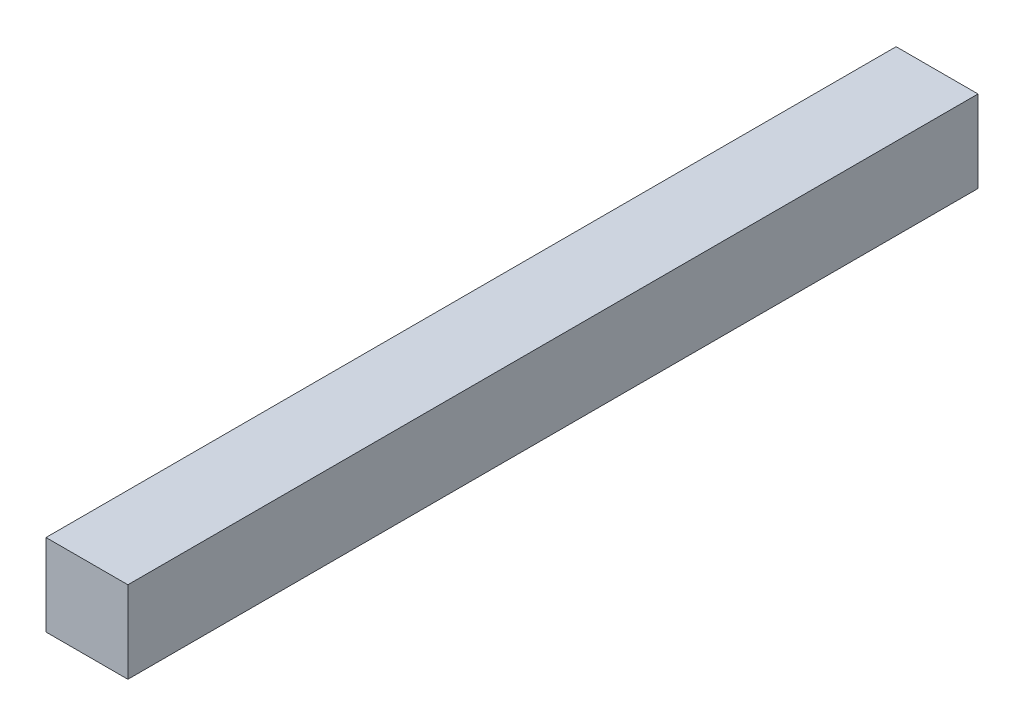
ISO-10303-21;
HEADER;
FILE_DESCRIPTION(('STEP AP214'),'2;1');
FILE_NAME('part.step','',(''),(''),'','','');
FILE_SCHEMA(('AUTOMOTIVE_DESIGN { 1 0 10303 214 1 1 1 1 }'));
ENDSEC;
DATA;
#1=APPLICATION_CONTEXT('core data for automotive mechanical design processes');
#2=APPLICATION_PROTOCOL_DEFINITION('international standard','automotive_design',2000,#1);
#3=PRODUCT_CONTEXT('',#1,'mechanical');
#4=PRODUCT('Part','Part','',(#3));
#5=PRODUCT_RELATED_PRODUCT_CATEGORY('part','',(#4));
#6=PRODUCT_DEFINITION_FORMATION('','',#4);
#7=PRODUCT_DEFINITION_CONTEXT('part definition',#1,'design');
#8=PRODUCT_DEFINITION('design','',#6,#7);
#9=PRODUCT_DEFINITION_SHAPE('','',#8);
#10=(LENGTH_UNIT() NAMED_UNIT(*) SI_UNIT(.MILLI.,.METRE.));
#11=(NAMED_UNIT(*) PLANE_ANGLE_UNIT() SI_UNIT($,.RADIAN.));
#12=(NAMED_UNIT(*) SI_UNIT($,.STERADIAN.) SOLID_ANGLE_UNIT());
#13=UNCERTAINTY_MEASURE_WITH_UNIT(LENGTH_MEASURE(1.E-05),#10,'distance_accuracy_value','');
#14=(GEOMETRIC_REPRESENTATION_CONTEXT(3) GLOBAL_UNCERTAINTY_ASSIGNED_CONTEXT((#13)) GLOBAL_UNIT_ASSIGNED_CONTEXT((#10,
#11,#12)) REPRESENTATION_CONTEXT('',''));
#15=CARTESIAN_POINT('',(0.,0.,0.));
#16=DIRECTION('',(0.,0.,1.));
#17=DIRECTION('',(1.,0.,0.));
#18=AXIS2_PLACEMENT_3D('',#15,#16,#17);
#19=CARTESIAN_POINT('',(0.,0.,381.));
#20=DIRECTION('',(0.,1.,0.));
#21=DIRECTION('',(-1.,0.,0.));
#22=AXIS2_PLACEMENT_3D('',#19,#20,#21);
#23=PLANE('',#22);
#24=DIRECTION('',(1.,0.,0.));
#25=VECTOR('',#24,1.);
#26=CARTESIAN_POINT('',(0.,0.,0.));
#27=LINE('',#26,#25);
#28=CARTESIAN_POINT('',(-36.7,0.,0.));
#29=VERTEX_POINT('',#28);
#30=CARTESIAN_POINT('',(0.,0.,0.));
#31=VERTEX_POINT('',#30);
#32=EDGE_CURVE('E113',#29,#31,#27,.T.);
#33=ORIENTED_EDGE('',*,*,#32,.T.);
#34=DIRECTION('',(0.,0.,-1.));
#35=VECTOR('',#34,1.);
#36=CARTESIAN_POINT('',(0.,0.,381.));
#37=LINE('',#36,#35);
#38=CARTESIAN_POINT('',(0.,0.,381.));
#39=VERTEX_POINT('',#38);
#40=EDGE_CURVE('E11',#39,#31,#37,.T.);
#41=ORIENTED_EDGE('',*,*,#40,.F.);
#42=DIRECTION('',(1.,0.,0.));
#43=VECTOR('',#42,1.);
#44=CARTESIAN_POINT('',(0.,0.,381.));
#45=LINE('',#44,#43);
#46=CARTESIAN_POINT('',(-36.7,0.,381.));
#47=VERTEX_POINT('',#46);
#48=EDGE_CURVE('E97',#47,#39,#45,.T.);
#49=ORIENTED_EDGE('',*,*,#48,.F.);
#50=DIRECTION('',(0.,0.,-1.));
#51=VECTOR('',#50,1.);
#52=CARTESIAN_POINT('',(-36.7,0.,381.));
#53=LINE('',#52,#51);
#54=EDGE_CURVE('E109',#47,#29,#53,.T.);
#55=ORIENTED_EDGE('',*,*,#54,.T.);
#56=EDGE_LOOP('',(#33,#41,#49,#55));
#57=FACE_BOUND('',#56,.T.);
#58=ADVANCED_FACE('F45',(#57),#23,.F.);
#59=CARTESIAN_POINT('',(0.,0.,381.));
#60=DIRECTION('',(-1.,0.,0.));
#61=DIRECTION('',(0.,0.,1.));
#62=AXIS2_PLACEMENT_3D('',#59,#60,#61);
#63=PLANE('',#62);
#64=DIRECTION('',(0.,1.,0.));
#65=VECTOR('',#64,1.);
#66=CARTESIAN_POINT('',(0.,0.,0.));
#67=LINE('',#66,#65);
#68=CARTESIAN_POINT('',(0.,36.7,0.));
#69=VERTEX_POINT('',#68);
#70=EDGE_CURVE('E102',#31,#69,#67,.T.);
#71=ORIENTED_EDGE('',*,*,#70,.T.);
#72=DIRECTION('',(0.,0.,-1.));
#73=VECTOR('',#72,1.);
#74=CARTESIAN_POINT('',(0.,36.7,381.));
#75=LINE('',#74,#73);
#76=CARTESIAN_POINT('',(0.,36.7,381.));
#77=VERTEX_POINT('',#76);
#78=EDGE_CURVE('E54',#77,#69,#75,.T.);
#79=ORIENTED_EDGE('',*,*,#78,.F.);
#80=DIRECTION('',(0.,1.,0.));
#81=VECTOR('',#80,1.);
#82=CARTESIAN_POINT('',(0.,0.,381.));
#83=LINE('',#82,#81);
#84=EDGE_CURVE('E92',#39,#77,#83,.T.);
#85=ORIENTED_EDGE('',*,*,#84,.F.);
#86=ORIENTED_EDGE('',*,*,#40,.T.);
#87=EDGE_LOOP('',(#71,#79,#85,#86));
#88=FACE_BOUND('',#87,.T.);
#89=ADVANCED_FACE('F101',(#88),#63,.F.);
#90=CARTESIAN_POINT('',(0.,36.7,381.));
#91=DIRECTION('',(0.,-1.,0.));
#92=DIRECTION('',(1.,0.,0.));
#93=AXIS2_PLACEMENT_3D('',#90,#91,#92);
#94=PLANE('',#93);
#95=DIRECTION('',(-1.,0.,0.));
#96=VECTOR('',#95,1.);
#97=CARTESIAN_POINT('',(0.,36.7,0.));
#98=LINE('',#97,#96);
#99=CARTESIAN_POINT('',(-36.7,36.7,0.));
#100=VERTEX_POINT('',#99);
#101=EDGE_CURVE('E79',#69,#100,#98,.T.);
#102=ORIENTED_EDGE('',*,*,#101,.T.);
#103=DIRECTION('',(0.,0.,-1.));
#104=VECTOR('',#103,1.);
#105=CARTESIAN_POINT('',(-36.7,36.7,381.));
#106=LINE('',#105,#104);
#107=CARTESIAN_POINT('',(-36.7,36.7,381.));
#108=VERTEX_POINT('',#107);
#109=EDGE_CURVE('E104',#108,#100,#106,.T.);
#110=ORIENTED_EDGE('',*,*,#109,.F.);
#111=DIRECTION('',(-1.,0.,0.));
#112=VECTOR('',#111,1.);
#113=CARTESIAN_POINT('',(0.,36.7,381.));
#114=LINE('',#113,#112);
#115=EDGE_CURVE('E95',#77,#108,#114,.T.);
#116=ORIENTED_EDGE('',*,*,#115,.F.);
#117=ORIENTED_EDGE('',*,*,#78,.T.);
#118=EDGE_LOOP('',(#102,#110,#116,#117));
#119=FACE_BOUND('',#118,.T.);
#120=ADVANCED_FACE('F105',(#119),#94,.F.);
#121=CARTESIAN_POINT('',(-36.7,0.,381.));
#122=DIRECTION('',(1.,0.,0.));
#123=DIRECTION('',(0.,0.,-1.));
#124=AXIS2_PLACEMENT_3D('',#121,#122,#123);
#125=PLANE('',#124);
#126=DIRECTION('',(0.,-1.,0.));
#127=VECTOR('',#126,1.);
#128=CARTESIAN_POINT('',(-36.7,0.,0.));
#129=LINE('',#128,#127);
#130=EDGE_CURVE('E85',#100,#29,#129,.T.);
#131=ORIENTED_EDGE('',*,*,#130,.T.);
#132=ORIENTED_EDGE('',*,*,#54,.F.);
#133=DIRECTION('',(0.,-1.,0.));
#134=VECTOR('',#133,1.);
#135=CARTESIAN_POINT('',(-36.7,0.,381.));
#136=LINE('',#135,#134);
#137=EDGE_CURVE('E62',#108,#47,#136,.T.);
#138=ORIENTED_EDGE('',*,*,#137,.F.);
#139=ORIENTED_EDGE('',*,*,#109,.T.);
#140=EDGE_LOOP('',(#131,#132,#138,#139));
#141=FACE_BOUND('',#140,.T.);
#142=ADVANCED_FACE('F126',(#141),#125,.F.);
#143=CARTESIAN_POINT('',(0.,0.,381.));
#144=DIRECTION('',(0.,0.,-1.));
#145=DIRECTION('',(-1.,0.,0.));
#146=AXIS2_PLACEMENT_3D('',#143,#144,#145);
#147=PLANE('',#146);
#148=ORIENTED_EDGE('',*,*,#48,.T.);
#149=ORIENTED_EDGE('',*,*,#84,.T.);
#150=ORIENTED_EDGE('',*,*,#115,.T.);
#151=ORIENTED_EDGE('',*,*,#137,.T.);
#152=EDGE_LOOP('',(#148,#149,#150,#151));
#153=FACE_BOUND('',#152,.T.);
#154=ADVANCED_FACE('F93',(#153),#147,.F.);
#155=CARTESIAN_POINT('',(0.,0.,0.));
#156=DIRECTION('',(0.,0.,-1.));
#157=DIRECTION('',(-1.,0.,0.));
#158=AXIS2_PLACEMENT_3D('',#155,#156,#157);
#159=PLANE('',#158);
#160=ORIENTED_EDGE('',*,*,#32,.F.);
#161=ORIENTED_EDGE('',*,*,#130,.F.);
#162=ORIENTED_EDGE('',*,*,#101,.F.);
#163=ORIENTED_EDGE('',*,*,#70,.F.);
#164=EDGE_LOOP('',(#160,#161,#162,#163));
#165=FACE_BOUND('',#164,.T.);
#166=ADVANCED_FACE('F129',(#165),#159,.T.);
#167=CLOSED_SHELL('',(#58,#89,#120,#142,#154,#166));
#168=MANIFOLD_SOLID_BREP('B2',#167);
#169=ADVANCED_BREP_SHAPE_REPRESENTATION('',(#18,#168),#14);
#170=SHAPE_DEFINITION_REPRESENTATION(#9,#169);
ENDSEC;
END-ISO-10303-21;
